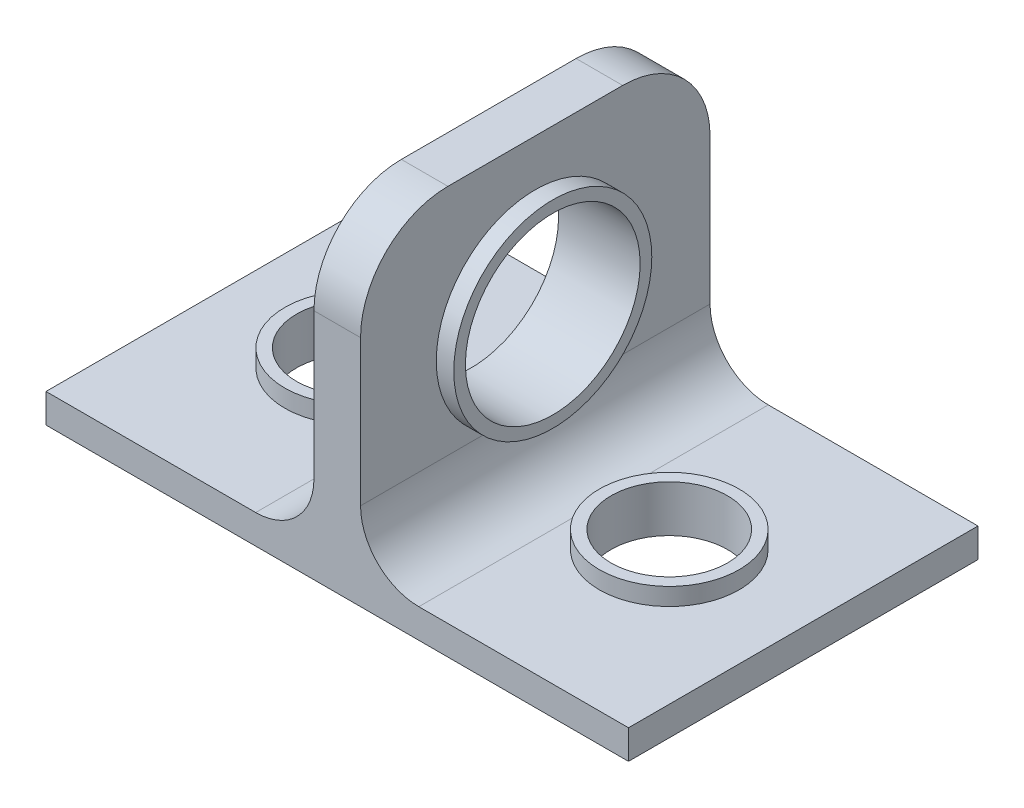
ISO-10303-21;
HEADER;
FILE_DESCRIPTION(('STEP AP214'),'2;1');
FILE_NAME('part.step','',(''),(''),'','','');
FILE_SCHEMA(('AUTOMOTIVE_DESIGN { 1 0 10303 214 1 1 1 1 }'));
ENDSEC;
DATA;
#1=APPLICATION_CONTEXT('core data for automotive mechanical design processes');
#2=APPLICATION_PROTOCOL_DEFINITION('international standard','automotive_design',2000,#1);
#3=PRODUCT_CONTEXT('',#1,'mechanical');
#4=PRODUCT('Part','Part','',(#3));
#5=PRODUCT_RELATED_PRODUCT_CATEGORY('part','',(#4));
#6=PRODUCT_DEFINITION_FORMATION('','',#4);
#7=PRODUCT_DEFINITION_CONTEXT('part definition',#1,'design');
#8=PRODUCT_DEFINITION('design','',#6,#7);
#9=PRODUCT_DEFINITION_SHAPE('','',#8);
#10=(LENGTH_UNIT() NAMED_UNIT(*) SI_UNIT(.MILLI.,.METRE.));
#11=(NAMED_UNIT(*) PLANE_ANGLE_UNIT() SI_UNIT($,.RADIAN.));
#12=(NAMED_UNIT(*) SI_UNIT($,.STERADIAN.) SOLID_ANGLE_UNIT());
#13=UNCERTAINTY_MEASURE_WITH_UNIT(LENGTH_MEASURE(1.E-05),#10,'distance_accuracy_value','');
#14=(GEOMETRIC_REPRESENTATION_CONTEXT(3) GLOBAL_UNCERTAINTY_ASSIGNED_CONTEXT((#13)) GLOBAL_UNIT_ASSIGNED_CONTEXT((#10,
#11,#12)) REPRESENTATION_CONTEXT('',''));
#15=CARTESIAN_POINT('',(0.,0.,0.));
#16=DIRECTION('',(0.,0.,1.));
#17=DIRECTION('',(1.,0.,0.));
#18=AXIS2_PLACEMENT_3D('',#15,#16,#17);
#19=CARTESIAN_POINT('',(-14.,15.,-30.));
#20=DIRECTION('',(0.,0.,1.));
#21=DIRECTION('',(1.,0.,0.));
#22=AXIS2_PLACEMENT_3D('',#19,#20,#21);
#23=CYLINDRICAL_SURFACE('',#22,10.);
#24=DIRECTION('',(0.,0.,1.));
#25=VECTOR('',#24,1.);
#26=CARTESIAN_POINT('',(-4.,15.0000000000001,-30.));
#27=LINE('',#26,#25);
#28=CARTESIAN_POINT('',(-4.,15.0000000000001,8.00000000000013));
#29=VERTEX_POINT('',#28);
#30=CARTESIAN_POINT('',(-4.,15.0000000000001,30.));
#31=VERTEX_POINT('',#30);
#32=EDGE_CURVE('E316',#29,#31,#27,.T.);
#33=ORIENTED_EDGE('',*,*,#32,.F.);
#34=CARTESIAN_POINT('',(-4.,15.0000000000001,8.00000000000012));
#35=CARTESIAN_POINT('',(-4.00000486799966,14.900377751049,7.81320903883377));
#36=CARTESIAN_POINT('',(-4.00148805320615,14.8042585845157,7.62458107130544));
#37=CARTESIAN_POINT('',(-4.00682518181483,14.6191477203191,7.24390634337324));
#38=CARTESIAN_POINT('',(-4.01067897341392,14.530155566686,7.05185980264419));
#39=CARTESIAN_POINT('',(-4.02491374910977,14.2741076972079,6.4711080787597));
#40=CARTESIAN_POINT('',(-4.03796916275996,14.1178933153698,6.07762713291724));
#41=CARTESIAN_POINT('',(-4.06703264763406,13.8353905254942,5.28054100431086));
#42=CARTESIAN_POINT('',(-4.08303862544329,13.709081044275,4.87694317376301));
#43=CARTESIAN_POINT('',(-4.11450558018434,13.4868603724836,4.06138667405105));
#44=CARTESIAN_POINT('',(-4.12996648982569,13.390952923544,3.6494269824111));
#45=CARTESIAN_POINT('',(-4.15919230815506,13.2204114768832,2.76941955567808));
#46=CARTESIAN_POINT('',(-4.17252940263093,13.1497249318905,2.30058661382753));
#47=CARTESIAN_POINT('',(-4.19227886205206,13.0477436032132,1.35849340247754));
#48=CARTESIAN_POINT('',(-4.19869093784764,13.0164504643657,0.885232948942356));
#49=CARTESIAN_POINT('',(-4.20336119752856,12.9935069919335,-0.062428056873824));
#50=CARTESIAN_POINT('',(-4.20161707770245,13.0018678586029,-0.536828893434181));
#51=CARTESIAN_POINT('',(-4.19030121997448,13.0581915376799,-1.4831789818672));
#52=CARTESIAN_POINT('',(-4.18072937671124,13.1061548831381,-1.95512820065497));
#53=CARTESIAN_POINT('',(-4.1551742182235,13.2437329813335,-2.91007954202622));
#54=CARTESIAN_POINT('',(-4.13897261516375,13.3347842228982,-3.39286840372245));
#55=CARTESIAN_POINT('',(-4.10382332059191,13.558306128706,-4.34874212168266));
#56=CARTESIAN_POINT('',(-4.0848755031126,13.6907786932434,-4.82182653167231));
#57=CARTESIAN_POINT('',(-4.05820479207035,13.9199212887304,-5.52191925898009));
#58=CARTESIAN_POINT('',(-4.04959797073984,14.0014799686617,-5.75394212484878));
#59=CARTESIAN_POINT('',(-4.03374227472945,14.17460549874,-6.21428513831506));
#60=CARTESIAN_POINT('',(-4.02649337175973,14.2661721403258,-6.44260536296017));
#61=CARTESIAN_POINT('',(-4.01416727999489,14.4591621057481,-6.89513365008931));
#62=CARTESIAN_POINT('',(-4.00909035503783,14.5605866252214,-7.11934120982864));
#63=CARTESIAN_POINT('',(-4.0020121621829,14.7730970721199,-7.56320095532259));
#64=CARTESIAN_POINT('',(-4.00001115821899,14.8841838277635,-7.78285274856779));
#65=CARTESIAN_POINT('',(-4.,15.0000000000001,-8.00000000000012));
#66=B_SPLINE_CURVE_WITH_KNOTS('',3,(#34,#35,#36,#37,#38,#39,#40,#41,#42,#43,#44,#45,#46,#47,#48,
#49,#50,#51,#52,#53,#54,#55,#56,#57,#58,#59,#60,#61,#62,#63,#64,#65),.UNSPECIFIED.,.F.,.F.,(4,2,
2,2,2,2,2,2,2,2,2,2,2,2,2,4),(0.,0.634996958217504,1.26995325828721,2.53931094059223,
3.80777146042295,5.07638803140857,6.49762705126029,7.91892541173113,9.3406252411186,
10.7623442069417,12.2352152307439,13.7081538356573,14.4462333845569,15.1842975551491,
15.9224513556375,16.6606684909713),.UNSPECIFIED.);
#67=CARTESIAN_POINT('',(-4.,15.0000000000001,-8.00000000000013));
#68=VERTEX_POINT('',#67);
#69=EDGE_CURVE('E224',#29,#68,#66,.T.);
#70=ORIENTED_EDGE('',*,*,#69,.T.);
#71=CARTESIAN_POINT('',(-4.,15.0000000000001,-30.));
#72=VERTEX_POINT('',#71);
#73=EDGE_CURVE('E337',#72,#68,#27,.T.);
#74=ORIENTED_EDGE('',*,*,#73,.F.);
#75=CARTESIAN_POINT('',(-14.,15.,-30.));
#76=DIRECTION('',(0.,0.,-1.));
#77=DIRECTION('',(1.,0.,0.));
#78=AXIS2_PLACEMENT_3D('',#75,#76,#77);
#79=CIRCLE('',#78,10.);
#80=CARTESIAN_POINT('',(-14.0000000000001,4.99999999999999,-30.));
#81=VERTEX_POINT('',#80);
#82=EDGE_CURVE('E311',#72,#81,#79,.T.);
#83=ORIENTED_EDGE('',*,*,#82,.T.);
#84=DIRECTION('',(0.,0.,1.));
#85=VECTOR('',#84,1.);
#86=CARTESIAN_POINT('',(-14.0000000000001,4.99999999999999,-30.));
#87=LINE('',#86,#85);
#88=CARTESIAN_POINT('',(-14.0000000000001,4.99999999999999,30.));
#89=VERTEX_POINT('',#88);
#90=EDGE_CURVE('E336',#81,#89,#87,.T.);
#91=ORIENTED_EDGE('',*,*,#90,.T.);
#92=CARTESIAN_POINT('',(-14.,15.,30.));
#93=DIRECTION('',(0.,0.,-1.));
#94=DIRECTION('',(1.,0.,0.));
#95=AXIS2_PLACEMENT_3D('',#92,#93,#94);
#96=CIRCLE('',#95,10.);
#97=EDGE_CURVE('E344',#31,#89,#96,.T.);
#98=ORIENTED_EDGE('',*,*,#97,.F.);
#99=EDGE_LOOP('',(#33,#70,#74,#83,#91,#98));
#100=FACE_BOUND('',#99,.T.);
#101=ADVANCED_FACE('F63',(#100),#23,.F.);
#102=CARTESIAN_POINT('',(-4.,15.0000000000001,-30.));
#103=DIRECTION('',(-1.,0.,0.));
#104=DIRECTION('',(0.,0.,1.));
#105=AXIS2_PLACEMENT_3D('',#102,#103,#104);
#106=PLANE('',#105);
#107=DIRECTION('',(0.,-1.,0.));
#108=VECTOR('',#107,1.);
#109=CARTESIAN_POINT('',(-4.,15.0000000000001,30.));
#110=LINE('',#109,#108);
#111=CARTESIAN_POINT('',(-4.,40.,30.));
#112=VERTEX_POINT('',#111);
#113=EDGE_CURVE('E342',#112,#31,#110,.T.);
#114=ORIENTED_EDGE('',*,*,#113,.F.);
#115=CARTESIAN_POINT('',(-4.,40.,15.));
#116=DIRECTION('',(-1.,0.,0.));
#117=DIRECTION('',(0.,0.,1.));
#118=AXIS2_PLACEMENT_3D('',#115,#116,#117);
#119=CIRCLE('',#118,15.);
#120=CARTESIAN_POINT('',(-4.,55.,15.));
#121=VERTEX_POINT('',#120);
#122=EDGE_CURVE('E300',#112,#121,#119,.T.);
#123=ORIENTED_EDGE('',*,*,#122,.T.);
#124=DIRECTION('',(0.,0.,1.));
#125=VECTOR('',#124,1.);
#126=CARTESIAN_POINT('',(-4.,55.,-30.));
#127=LINE('',#126,#125);
#128=CARTESIAN_POINT('',(-4.,55.,-15.));
#129=VERTEX_POINT('',#128);
#130=EDGE_CURVE('E306',#129,#121,#127,.T.);
#131=ORIENTED_EDGE('',*,*,#130,.F.);
#132=CARTESIAN_POINT('',(-4.,40.,-15.));
#133=DIRECTION('',(-1.,0.,0.));
#134=DIRECTION('',(0.,0.,1.));
#135=AXIS2_PLACEMENT_3D('',#132,#133,#134);
#136=CIRCLE('',#135,15.);
#137=CARTESIAN_POINT('',(-4.,40.,-30.));
#138=VERTEX_POINT('',#137);
#139=EDGE_CURVE('E190',#129,#138,#136,.T.);
#140=ORIENTED_EDGE('',*,*,#139,.T.);
#141=DIRECTION('',(0.,-1.,0.));
#142=VECTOR('',#141,1.);
#143=CARTESIAN_POINT('',(-4.,15.0000000000001,-30.));
#144=LINE('',#143,#142);
#145=EDGE_CURVE('E304',#138,#72,#144,.T.);
#146=ORIENTED_EDGE('',*,*,#145,.T.);
#147=ORIENTED_EDGE('',*,*,#73,.T.);
#148=CARTESIAN_POINT('',(-4.,30.,0.));
#149=DIRECTION('',(-1.,0.,0.));
#150=DIRECTION('',(0.,0.,1.));
#151=AXIS2_PLACEMENT_3D('',#148,#149,#150);
#152=CIRCLE('',#151,17.);
#153=EDGE_CURVE('E235',#29,#68,#152,.T.);
#154=ORIENTED_EDGE('',*,*,#153,.F.);
#155=ORIENTED_EDGE('',*,*,#32,.T.);
#156=EDGE_LOOP('',(#114,#123,#131,#140,#146,#147,#154,#155));
#157=FACE_BOUND('',#156,.T.);
#158=ADVANCED_FACE('F242',(#157),#106,.T.);
#159=CARTESIAN_POINT('',(-50.,4.99999999999999,-30.));
#160=DIRECTION('',(0.,1.,0.));
#161=DIRECTION('',(0.,0.,1.));
#162=AXIS2_PLACEMENT_3D('',#159,#160,#161);
#163=PLANE('',#162);
#164=DIRECTION('',(0.,0.,1.));
#165=VECTOR('',#164,1.);
#166=CARTESIAN_POINT('',(-50.,4.99999999999999,-30.));
#167=LINE('',#166,#165);
#168=CARTESIAN_POINT('',(-50.,4.99999999999999,-30.));
#169=VERTEX_POINT('',#168);
#170=CARTESIAN_POINT('',(-50.,4.99999999999999,30.));
#171=VERTEX_POINT('',#170);
#172=EDGE_CURVE('E193',#169,#171,#167,.T.);
#173=ORIENTED_EDGE('',*,*,#172,.T.);
#174=DIRECTION('',(-1.,0.,0.));
#175=VECTOR('',#174,1.);
#176=CARTESIAN_POINT('',(-50.,4.99999999999999,30.));
#177=LINE('',#176,#175);
#178=EDGE_CURVE('E348',#89,#171,#177,.T.);
#179=ORIENTED_EDGE('',*,*,#178,.F.);
#180=ORIENTED_EDGE('',*,*,#90,.F.);
#181=DIRECTION('',(-1.,0.,0.));
#182=VECTOR('',#181,1.);
#183=CARTESIAN_POINT('',(-50.,4.99999999999999,-30.));
#184=LINE('',#183,#182);
#185=EDGE_CURVE('E326',#81,#169,#184,.T.);
#186=ORIENTED_EDGE('',*,*,#185,.T.);
#187=EDGE_LOOP('',(#173,#179,#180,#186));
#188=FACE_BOUND('',#187,.T.);
#189=CARTESIAN_POINT('',(-27.,4.99999999999999,0.));
#190=DIRECTION('',(0.,1.,0.));
#191=DIRECTION('',(0.,0.,1.));
#192=AXIS2_PLACEMENT_3D('',#189,#190,#191);
#193=CIRCLE('',#192,12.);
#194=CARTESIAN_POINT('',(-27.,4.99999999999999,12.));
#195=VERTEX_POINT('',#194);
#196=EDGE_CURVE('E395',#195,#195,#193,.T.);
#197=ORIENTED_EDGE('',*,*,#196,.F.);
#198=EDGE_LOOP('',(#197));
#199=FACE_BOUND('',#198,.T.);
#200=ADVANCED_FACE('F244',(#188,#199),#163,.T.);
#201=CARTESIAN_POINT('',(-50.,0.,-30.));
#202=DIRECTION('',(-1.,0.,0.));
#203=DIRECTION('',(0.,0.,1.));
#204=AXIS2_PLACEMENT_3D('',#201,#202,#203);
#205=PLANE('',#204);
#206=DIRECTION('',(0.,0.,1.));
#207=VECTOR('',#206,1.);
#208=CARTESIAN_POINT('',(-50.,0.,-30.));
#209=LINE('',#208,#207);
#210=CARTESIAN_POINT('',(-50.,0.,-30.));
#211=VERTEX_POINT('',#210);
#212=CARTESIAN_POINT('',(-50.,0.,30.));
#213=VERTEX_POINT('',#212);
#214=EDGE_CURVE('E325',#211,#213,#209,.T.);
#215=ORIENTED_EDGE('',*,*,#214,.T.);
#216=DIRECTION('',(0.,-1.,0.));
#217=VECTOR('',#216,1.);
#218=CARTESIAN_POINT('',(-50.,0.,30.));
#219=LINE('',#218,#217);
#220=EDGE_CURVE('E380',#171,#213,#219,.T.);
#221=ORIENTED_EDGE('',*,*,#220,.F.);
#222=ORIENTED_EDGE('',*,*,#172,.F.);
#223=DIRECTION('',(0.,-1.,0.));
#224=VECTOR('',#223,1.);
#225=CARTESIAN_POINT('',(-50.,0.,-30.));
#226=LINE('',#225,#224);
#227=EDGE_CURVE('E350',#169,#211,#226,.T.);
#228=ORIENTED_EDGE('',*,*,#227,.T.);
#229=EDGE_LOOP('',(#215,#221,#222,#228));
#230=FACE_BOUND('',#229,.T.);
#231=ADVANCED_FACE('F251',(#230),#205,.T.);
#232=CARTESIAN_POINT('',(-4.,55.,-30.));
#233=DIRECTION('',(0.,1.,0.));
#234=DIRECTION('',(0.,0.,1.));
#235=AXIS2_PLACEMENT_3D('',#232,#233,#234);
#236=PLANE('',#235);
#237=ORIENTED_EDGE('',*,*,#130,.T.);
#238=DIRECTION('',(-1.,0.,0.));
#239=VECTOR('',#238,1.);
#240=CARTESIAN_POINT('',(-4.,55.,15.));
#241=LINE('',#240,#239);
#242=CARTESIAN_POINT('',(4.,55.,15.));
#243=VERTEX_POINT('',#242);
#244=EDGE_CURVE('E84',#121,#243,#241,.F.);
#245=ORIENTED_EDGE('',*,*,#244,.T.);
#246=DIRECTION('',(0.,0.,1.));
#247=VECTOR('',#246,1.);
#248=CARTESIAN_POINT('',(4.,55.,-30.));
#249=LINE('',#248,#247);
#250=CARTESIAN_POINT('',(4.,55.,-15.));
#251=VERTEX_POINT('',#250);
#252=EDGE_CURVE('E174',#251,#243,#249,.T.);
#253=ORIENTED_EDGE('',*,*,#252,.F.);
#254=DIRECTION('',(-1.,0.,0.));
#255=VECTOR('',#254,1.);
#256=CARTESIAN_POINT('',(-4.,55.,-15.));
#257=LINE('',#256,#255);
#258=EDGE_CURVE('E297',#251,#129,#257,.T.);
#259=ORIENTED_EDGE('',*,*,#258,.T.);
#260=EDGE_LOOP('',(#237,#245,#253,#259));
#261=FACE_BOUND('',#260,.T.);
#262=ADVANCED_FACE('F249',(#261),#236,.T.);
#263=CARTESIAN_POINT('',(4.,15.0000000000001,-30.));
#264=DIRECTION('',(1.,0.,0.));
#265=DIRECTION('',(0.,0.,-1.));
#266=AXIS2_PLACEMENT_3D('',#263,#264,#265);
#267=PLANE('',#266);
#268=ORIENTED_EDGE('',*,*,#252,.T.);
#269=CARTESIAN_POINT('',(4.,40.,15.));
#270=DIRECTION('',(1.,0.,0.));
#271=DIRECTION('',(0.,0.,-1.));
#272=AXIS2_PLACEMENT_3D('',#269,#270,#271);
#273=CIRCLE('',#272,15.);
#274=CARTESIAN_POINT('',(4.,40.,30.));
#275=VERTEX_POINT('',#274);
#276=EDGE_CURVE('E71',#243,#275,#273,.T.);
#277=ORIENTED_EDGE('',*,*,#276,.T.);
#278=DIRECTION('',(0.,1.,0.));
#279=VECTOR('',#278,1.);
#280=CARTESIAN_POINT('',(4.,15.0000000000001,30.));
#281=LINE('',#280,#279);
#282=CARTESIAN_POINT('',(4.,15.0000000000001,30.));
#283=VERTEX_POINT('',#282);
#284=EDGE_CURVE('E352',#283,#275,#281,.T.);
#285=ORIENTED_EDGE('',*,*,#284,.F.);
#286=DIRECTION('',(0.,0.,1.));
#287=VECTOR('',#286,1.);
#288=CARTESIAN_POINT('',(4.,15.0000000000001,-30.));
#289=LINE('',#288,#287);
#290=CARTESIAN_POINT('',(4.,15.0000000000001,7.99999999999999));
#291=VERTEX_POINT('',#290);
#292=EDGE_CURVE('E175',#291,#283,#289,.T.);
#293=ORIENTED_EDGE('',*,*,#292,.F.);
#294=CARTESIAN_POINT('',(4.,30.,0.));
#295=DIRECTION('',(-1.,0.,0.));
#296=DIRECTION('',(0.,0.,1.));
#297=AXIS2_PLACEMENT_3D('',#294,#295,#296);
#298=CIRCLE('',#297,17.);
#299=CARTESIAN_POINT('',(4.,15.,-7.99999999999999));
#300=VERTEX_POINT('',#299);
#301=EDGE_CURVE('E178',#291,#300,#298,.T.);
#302=ORIENTED_EDGE('',*,*,#301,.T.);
#303=CARTESIAN_POINT('',(4.,15.0000000000001,-30.));
#304=VERTEX_POINT('',#303);
#305=EDGE_CURVE('E165',#304,#300,#289,.T.);
#306=ORIENTED_EDGE('',*,*,#305,.F.);
#307=DIRECTION('',(0.,1.,0.));
#308=VECTOR('',#307,1.);
#309=CARTESIAN_POINT('',(4.,15.0000000000001,-30.));
#310=LINE('',#309,#308);
#311=CARTESIAN_POINT('',(4.,40.,-30.));
#312=VERTEX_POINT('',#311);
#313=EDGE_CURVE('E312',#304,#312,#310,.T.);
#314=ORIENTED_EDGE('',*,*,#313,.T.);
#315=CARTESIAN_POINT('',(4.,40.,-15.));
#316=DIRECTION('',(1.,0.,0.));
#317=DIRECTION('',(0.,0.,-1.));
#318=AXIS2_PLACEMENT_3D('',#315,#316,#317);
#319=CIRCLE('',#318,15.);
#320=EDGE_CURVE('E293',#312,#251,#319,.T.);
#321=ORIENTED_EDGE('',*,*,#320,.T.);
#322=EDGE_LOOP('',(#268,#277,#285,#293,#302,#306,#314,#321));
#323=FACE_BOUND('',#322,.T.);
#324=ADVANCED_FACE('F179',(#323),#267,.T.);
#325=CARTESIAN_POINT('',(14.,15.,-30.));
#326=DIRECTION('',(0.,0.,1.));
#327=DIRECTION('',(1.,0.,0.));
#328=AXIS2_PLACEMENT_3D('',#325,#326,#327);
#329=CYLINDRICAL_SURFACE('',#328,10.);
#330=CARTESIAN_POINT('',(4.,15.0000000000001,8.00000000000013));
#331=CARTESIAN_POINT('',(4.00000486799966,14.900377751049,7.81320903883377));
#332=CARTESIAN_POINT('',(4.00148805320616,14.8042585845157,7.62458107130544));
#333=CARTESIAN_POINT('',(4.00682518181483,14.6191477203191,7.24390634337325));
#334=CARTESIAN_POINT('',(4.01067897341392,14.530155566686,7.05185980264419));
#335=CARTESIAN_POINT('',(4.02491374910977,14.2741076972079,6.4711080787597));
#336=CARTESIAN_POINT('',(4.03796916275996,14.1178933153698,6.07762713291725));
#337=CARTESIAN_POINT('',(4.06703264763406,13.8353905254942,5.28054100431087));
#338=CARTESIAN_POINT('',(4.08303862544329,13.709081044275,4.87694317376302));
#339=CARTESIAN_POINT('',(4.11450558018433,13.4868603724836,4.06138667405105));
#340=CARTESIAN_POINT('',(4.12996648982569,13.390952923544,3.6494269824111));
#341=CARTESIAN_POINT('',(4.15919230815506,13.2204114768832,2.76941955567809));
#342=CARTESIAN_POINT('',(4.17252940263093,13.1497249318905,2.30058661382754));
#343=CARTESIAN_POINT('',(4.19227886205205,13.0477436032132,1.35849340247754));
#344=CARTESIAN_POINT('',(4.19869093784764,13.0164504643657,0.88523294894236));
#345=CARTESIAN_POINT('',(4.20336119752856,12.9935069919335,-0.0624280568738192));
#346=CARTESIAN_POINT('',(4.20161707770245,13.0018678586029,-0.536828893434176));
#347=CARTESIAN_POINT('',(4.19030121997448,13.0581915376799,-1.4831789818672));
#348=CARTESIAN_POINT('',(4.18072937671124,13.1061548831381,-1.95512820065497));
#349=CARTESIAN_POINT('',(4.1551742182235,13.2437329813335,-2.91007954202622));
#350=CARTESIAN_POINT('',(4.13897261516375,13.3347842228982,-3.39286840372245));
#351=CARTESIAN_POINT('',(4.10382332059191,13.558306128706,-4.34874212168267));
#352=CARTESIAN_POINT('',(4.0848755031126,13.6907786932434,-4.82182653167231));
#353=CARTESIAN_POINT('',(4.05820479207035,13.9199212887304,-5.52191925898009));
#354=CARTESIAN_POINT('',(4.04959797073984,14.0014799686617,-5.75394212484878));
#355=CARTESIAN_POINT('',(4.03374227472946,14.17460549874,-6.21428513831507));
#356=CARTESIAN_POINT('',(4.02649337175973,14.2661721403258,-6.44260536296018));
#357=CARTESIAN_POINT('',(4.01416727999489,14.4591621057481,-6.89513365008931));
#358=CARTESIAN_POINT('',(4.00909035503783,14.5605866252214,-7.11934120982865));
#359=CARTESIAN_POINT('',(4.0020121621829,14.7730970721199,-7.56320095532259));
#360=CARTESIAN_POINT('',(4.00001115821899,14.8841838277635,-7.7828527485678));
#361=CARTESIAN_POINT('',(4.,15.0000000000001,-8.00000000000012));
#362=B_SPLINE_CURVE_WITH_KNOTS('',3,(#330,#331,#332,#333,#334,#335,#336,#337,#338,#339,#340,
#341,#342,#343,#344,#345,#346,#347,#348,#349,#350,#351,#352,#353,#354,#355,#356,#357,#358,#359,
#360,#361),.UNSPECIFIED.,.F.,.F.,(4,2,2,2,2,2,2,2,2,2,2,2,2,2,2,4),(0.,0.634996958217504,
1.26995325828721,2.53931094059223,3.80777146042295,5.07638803140857,6.49762705126029,
7.91892541173113,9.3406252411186,10.7623442069417,12.2352152307439,13.7081538356573,
14.446233384557,15.1842975551491,15.9224513556376,16.6606684909713),.UNSPECIFIED.);
#363=EDGE_CURVE('E169',#291,#300,#362,.T.);
#364=ORIENTED_EDGE('',*,*,#363,.F.);
#365=ORIENTED_EDGE('',*,*,#292,.T.);
#366=CARTESIAN_POINT('',(14.,15.,30.));
#367=DIRECTION('',(0.,0.,-1.));
#368=DIRECTION('',(1.,0.,0.));
#369=AXIS2_PLACEMENT_3D('',#366,#367,#368);
#370=CIRCLE('',#369,10.);
#371=CARTESIAN_POINT('',(14.0000000000001,4.99999999999999,30.));
#372=VERTEX_POINT('',#371);
#373=EDGE_CURVE('E389',#372,#283,#370,.T.);
#374=ORIENTED_EDGE('',*,*,#373,.F.);
#375=DIRECTION('',(0.,0.,1.));
#376=VECTOR('',#375,1.);
#377=CARTESIAN_POINT('',(14.0000000000001,4.99999999999999,-30.));
#378=LINE('',#377,#376);
#379=CARTESIAN_POINT('',(14.0000000000001,4.99999999999999,-30.));
#380=VERTEX_POINT('',#379);
#381=EDGE_CURVE('E320',#380,#372,#378,.T.);
#382=ORIENTED_EDGE('',*,*,#381,.F.);
#383=CARTESIAN_POINT('',(14.,15.,-30.));
#384=DIRECTION('',(0.,0.,-1.));
#385=DIRECTION('',(1.,0.,0.));
#386=AXIS2_PLACEMENT_3D('',#383,#384,#385);
#387=CIRCLE('',#386,10.);
#388=EDGE_CURVE('E172',#380,#304,#387,.T.);
#389=ORIENTED_EDGE('',*,*,#388,.T.);
#390=ORIENTED_EDGE('',*,*,#305,.T.);
#391=EDGE_LOOP('',(#364,#365,#374,#382,#389,#390));
#392=FACE_BOUND('',#391,.T.);
#393=ADVANCED_FACE('F167',(#392),#329,.F.);
#394=CARTESIAN_POINT('',(50.,4.99999999999999,-30.));
#395=DIRECTION('',(0.,1.,0.));
#396=DIRECTION('',(0.,0.,1.));
#397=AXIS2_PLACEMENT_3D('',#394,#395,#396);
#398=PLANE('',#397);
#399=CARTESIAN_POINT('',(27.,4.99999999999999,0.));
#400=DIRECTION('',(0.,1.,0.));
#401=DIRECTION('',(0.,0.,1.));
#402=AXIS2_PLACEMENT_3D('',#399,#400,#401);
#403=CIRCLE('',#402,12.);
#404=CARTESIAN_POINT('',(27.,4.99999999999999,12.));
#405=VERTEX_POINT('',#404);
#406=EDGE_CURVE('E187',#405,#405,#403,.T.);
#407=ORIENTED_EDGE('',*,*,#406,.F.);
#408=EDGE_LOOP('',(#407));
#409=FACE_BOUND('',#408,.T.);
#410=ORIENTED_EDGE('',*,*,#381,.T.);
#411=DIRECTION('',(-1.,0.,0.));
#412=VECTOR('',#411,1.);
#413=CARTESIAN_POINT('',(50.,4.99999999999999,30.));
#414=LINE('',#413,#412);
#415=CARTESIAN_POINT('',(50.,4.99999999999999,30.));
#416=VERTEX_POINT('',#415);
#417=EDGE_CURVE('E382',#416,#372,#414,.T.);
#418=ORIENTED_EDGE('',*,*,#417,.F.);
#419=DIRECTION('',(0.,0.,1.));
#420=VECTOR('',#419,1.);
#421=CARTESIAN_POINT('',(50.,4.99999999999999,-30.));
#422=LINE('',#421,#420);
#423=CARTESIAN_POINT('',(50.,4.99999999999999,-30.));
#424=VERTEX_POINT('',#423);
#425=EDGE_CURVE('E322',#424,#416,#422,.T.);
#426=ORIENTED_EDGE('',*,*,#425,.F.);
#427=DIRECTION('',(-1.,0.,0.));
#428=VECTOR('',#427,1.);
#429=CARTESIAN_POINT('',(50.,4.99999999999999,-30.));
#430=LINE('',#429,#428);
#431=EDGE_CURVE('E363',#424,#380,#430,.T.);
#432=ORIENTED_EDGE('',*,*,#431,.T.);
#433=EDGE_LOOP('',(#410,#418,#426,#432));
#434=FACE_BOUND('',#433,.T.);
#435=ADVANCED_FACE('F257',(#409,#434),#398,.T.);
#436=CARTESIAN_POINT('',(50.,0.,-30.));
#437=DIRECTION('',(1.,0.,0.));
#438=DIRECTION('',(0.,0.,-1.));
#439=AXIS2_PLACEMENT_3D('',#436,#437,#438);
#440=PLANE('',#439);
#441=ORIENTED_EDGE('',*,*,#425,.T.);
#442=DIRECTION('',(0.,1.,0.));
#443=VECTOR('',#442,1.);
#444=CARTESIAN_POINT('',(50.,0.,30.));
#445=LINE('',#444,#443);
#446=CARTESIAN_POINT('',(50.,0.,30.));
#447=VERTEX_POINT('',#446);
#448=EDGE_CURVE('E374',#447,#416,#445,.T.);
#449=ORIENTED_EDGE('',*,*,#448,.F.);
#450=DIRECTION('',(0.,0.,1.));
#451=VECTOR('',#450,1.);
#452=CARTESIAN_POINT('',(50.,0.,-30.));
#453=LINE('',#452,#451);
#454=CARTESIAN_POINT('',(50.,0.,-30.));
#455=VERTEX_POINT('',#454);
#456=EDGE_CURVE('E324',#455,#447,#453,.T.);
#457=ORIENTED_EDGE('',*,*,#456,.F.);
#458=DIRECTION('',(0.,1.,0.));
#459=VECTOR('',#458,1.);
#460=CARTESIAN_POINT('',(50.,0.,-30.));
#461=LINE('',#460,#459);
#462=EDGE_CURVE('E360',#455,#424,#461,.T.);
#463=ORIENTED_EDGE('',*,*,#462,.T.);
#464=EDGE_LOOP('',(#441,#449,#457,#463));
#465=FACE_BOUND('',#464,.T.);
#466=ADVANCED_FACE('F262',(#465),#440,.T.);
#467=CARTESIAN_POINT('',(50.,0.,-30.));
#468=DIRECTION('',(0.,-1.,0.));
#469=DIRECTION('',(0.,0.,-1.));
#470=AXIS2_PLACEMENT_3D('',#467,#468,#469);
#471=PLANE('',#470);
#472=CARTESIAN_POINT('',(27.,0.,0.));
#473=DIRECTION('',(0.,-1.,0.));
#474=DIRECTION('',(0.,0.,-1.));
#475=AXIS2_PLACEMENT_3D('',#472,#473,#474);
#476=CIRCLE('',#475,10.);
#477=CARTESIAN_POINT('',(27.,0.,10.));
#478=VERTEX_POINT('',#477);
#479=EDGE_CURVE('E403',#478,#478,#476,.T.);
#480=ORIENTED_EDGE('',*,*,#479,.F.);
#481=EDGE_LOOP('',(#480));
#482=FACE_BOUND('',#481,.T.);
#483=CARTESIAN_POINT('',(-27.,0.,0.));
#484=DIRECTION('',(0.,-1.,0.));
#485=DIRECTION('',(0.,0.,-1.));
#486=AXIS2_PLACEMENT_3D('',#483,#484,#485);
#487=CIRCLE('',#486,10.);
#488=CARTESIAN_POINT('',(-27.,0.,10.));
#489=VERTEX_POINT('',#488);
#490=EDGE_CURVE('E384',#489,#489,#487,.F.);
#491=ORIENTED_EDGE('',*,*,#490,.T.);
#492=EDGE_LOOP('',(#491));
#493=FACE_BOUND('',#492,.T.);
#494=ORIENTED_EDGE('',*,*,#456,.T.);
#495=DIRECTION('',(1.,0.,0.));
#496=VECTOR('',#495,1.);
#497=CARTESIAN_POINT('',(50.,0.,30.));
#498=LINE('',#497,#496);
#499=EDGE_CURVE('E377',#213,#447,#498,.T.);
#500=ORIENTED_EDGE('',*,*,#499,.F.);
#501=ORIENTED_EDGE('',*,*,#214,.F.);
#502=DIRECTION('',(1.,0.,0.));
#503=VECTOR('',#502,1.);
#504=CARTESIAN_POINT('',(50.,0.,-30.));
#505=LINE('',#504,#503);
#506=EDGE_CURVE('E357',#211,#455,#505,.T.);
#507=ORIENTED_EDGE('',*,*,#506,.T.);
#508=EDGE_LOOP('',(#494,#500,#501,#507));
#509=FACE_BOUND('',#508,.T.);
#510=ADVANCED_FACE('F269',(#482,#493,#509),#471,.T.);
#511=CARTESIAN_POINT('',(-14.,15.,-30.));
#512=DIRECTION('',(0.,0.,1.));
#513=DIRECTION('',(1.,0.,0.));
#514=AXIS2_PLACEMENT_3D('',#511,#512,#513);
#515=PLANE('',#514);
#516=ORIENTED_EDGE('',*,*,#145,.F.);
#517=DIRECTION('',(-1.,0.,0.));
#518=VECTOR('',#517,1.);
#519=CARTESIAN_POINT('',(4.,40.,-30.));
#520=LINE('',#519,#518);
#521=EDGE_CURVE('E12',#138,#312,#520,.F.);
#522=ORIENTED_EDGE('',*,*,#521,.T.);
#523=ORIENTED_EDGE('',*,*,#313,.F.);
#524=ORIENTED_EDGE('',*,*,#388,.F.);
#525=ORIENTED_EDGE('',*,*,#431,.F.);
#526=ORIENTED_EDGE('',*,*,#462,.F.);
#527=ORIENTED_EDGE('',*,*,#506,.F.);
#528=ORIENTED_EDGE('',*,*,#227,.F.);
#529=ORIENTED_EDGE('',*,*,#185,.F.);
#530=ORIENTED_EDGE('',*,*,#82,.F.);
#531=EDGE_LOOP('',(#516,#522,#523,#524,#525,#526,#527,#528,#529,#530));
#532=FACE_BOUND('',#531,.T.);
#533=ADVANCED_FACE('F276',(#532),#515,.F.);
#534=CARTESIAN_POINT('',(-14.,15.,30.));
#535=DIRECTION('',(0.,0.,1.));
#536=DIRECTION('',(1.,0.,0.));
#537=AXIS2_PLACEMENT_3D('',#534,#535,#536);
#538=PLANE('',#537);
#539=ORIENTED_EDGE('',*,*,#284,.T.);
#540=DIRECTION('',(-1.,0.,0.));
#541=VECTOR('',#540,1.);
#542=CARTESIAN_POINT('',(-14.,40.,30.));
#543=LINE('',#542,#541);
#544=EDGE_CURVE('E186',#275,#112,#543,.T.);
#545=ORIENTED_EDGE('',*,*,#544,.T.);
#546=ORIENTED_EDGE('',*,*,#113,.T.);
#547=ORIENTED_EDGE('',*,*,#97,.T.);
#548=ORIENTED_EDGE('',*,*,#178,.T.);
#549=ORIENTED_EDGE('',*,*,#220,.T.);
#550=ORIENTED_EDGE('',*,*,#499,.T.);
#551=ORIENTED_EDGE('',*,*,#448,.T.);
#552=ORIENTED_EDGE('',*,*,#417,.T.);
#553=ORIENTED_EDGE('',*,*,#373,.T.);
#554=EDGE_LOOP('',(#539,#545,#546,#547,#548,#549,#550,#551,#552,#553));
#555=FACE_BOUND('',#554,.T.);
#556=ADVANCED_FACE('F379',(#555),#538,.T.);
#557=CARTESIAN_POINT('',(-27.,-28.2842712474619,0.));
#558=DIRECTION('',(0.,1.,0.));
#559=DIRECTION('',(0.,0.,1.));
#560=AXIS2_PLACEMENT_3D('',#557,#558,#559);
#561=CYLINDRICAL_SURFACE('',#560,10.);
#562=CARTESIAN_POINT('',(-27.,7.99999999999999,0.));
#563=DIRECTION('',(0.,1.,0.));
#564=DIRECTION('',(0.,0.,1.));
#565=AXIS2_PLACEMENT_3D('',#562,#563,#564);
#566=CIRCLE('',#565,10.);
#567=CARTESIAN_POINT('',(-27.,7.99999999999999,10.));
#568=VERTEX_POINT('',#567);
#569=EDGE_CURVE('E398',#568,#568,#566,.T.);
#570=CARTESIAN_POINT('',(-27.,0.,10.));
#571=CARTESIAN_POINT('',(-27.,0.0833333333333333,10.));
#572=CARTESIAN_POINT('',(-27.,0.166666666666667,10.));
#573=CARTESIAN_POINT('',(-27.,0.333333333333334,10.));
#574=CARTESIAN_POINT('',(-27.,0.416666666666667,10.));
#575=CARTESIAN_POINT('',(-27.,0.583333333333334,10.));
#576=CARTESIAN_POINT('',(-27.,0.666666666666667,10.));
#577=CARTESIAN_POINT('',(-27.,0.833333333333334,10.));
#578=CARTESIAN_POINT('',(-27.,0.916666666666668,10.));
#579=CARTESIAN_POINT('',(-27.,1.08333333333333,10.));
#580=CARTESIAN_POINT('',(-27.,1.16666666666667,10.));
#581=CARTESIAN_POINT('',(-27.,1.33333333333333,10.));
#582=CARTESIAN_POINT('',(-27.,1.41666666666666,10.));
#583=CARTESIAN_POINT('',(-27.,1.58333333333333,10.));
#584=CARTESIAN_POINT('',(-27.,1.66666666666666,10.));
#585=CARTESIAN_POINT('',(-27.,1.83333333333333,10.));
#586=CARTESIAN_POINT('',(-27.,1.91666666666666,10.));
#587=CARTESIAN_POINT('',(-27.,2.08333333333333,10.));
#588=CARTESIAN_POINT('',(-27.,2.16666666666667,10.));
#589=CARTESIAN_POINT('',(-27.,2.33333333333333,10.));
#590=CARTESIAN_POINT('',(-27.,2.41666666666667,10.));
#591=CARTESIAN_POINT('',(-27.,2.58333333333333,10.));
#592=CARTESIAN_POINT('',(-27.,2.66666666666667,10.));
#593=CARTESIAN_POINT('',(-27.,2.83333333333333,10.));
#594=CARTESIAN_POINT('',(-27.,2.91666666666666,10.));
#595=CARTESIAN_POINT('',(-27.,3.08333333333333,10.));
#596=CARTESIAN_POINT('',(-27.,3.16666666666666,10.));
#597=CARTESIAN_POINT('',(-27.,3.33333333333333,10.));
#598=CARTESIAN_POINT('',(-27.,3.41666666666666,10.));
#599=CARTESIAN_POINT('',(-27.,3.58333333333333,10.));
#600=CARTESIAN_POINT('',(-27.,3.66666666666666,10.));
#601=CARTESIAN_POINT('',(-27.,3.83333333333333,10.));
#602=CARTESIAN_POINT('',(-27.,3.91666666666666,10.));
#603=CARTESIAN_POINT('',(-27.,4.08333333333333,10.));
#604=CARTESIAN_POINT('',(-27.,4.16666666666666,10.));
#605=CARTESIAN_POINT('',(-27.,4.33333333333333,10.));
#606=CARTESIAN_POINT('',(-27.,4.41666666666666,10.));
#607=CARTESIAN_POINT('',(-27.,4.58333333333333,10.));
#608=CARTESIAN_POINT('',(-27.,4.66666666666666,10.));
#609=CARTESIAN_POINT('',(-27.,4.83333333333333,10.));
#610=CARTESIAN_POINT('',(-27.,4.91666666666666,10.));
#611=CARTESIAN_POINT('',(-27.,5.08333333333333,10.));
#612=CARTESIAN_POINT('',(-27.,5.16666666666666,10.));
#613=CARTESIAN_POINT('',(-27.,5.33333333333333,10.));
#614=CARTESIAN_POINT('',(-27.,5.41666666666666,10.));
#615=CARTESIAN_POINT('',(-27.,5.58333333333333,10.));
#616=CARTESIAN_POINT('',(-27.,5.66666666666666,10.));
#617=CARTESIAN_POINT('',(-27.,5.83333333333332,10.));
#618=CARTESIAN_POINT('',(-27.,5.91666666666665,10.));
#619=CARTESIAN_POINT('',(-27.,6.08333333333332,10.));
#620=CARTESIAN_POINT('',(-27.,6.16666666666665,10.));
#621=CARTESIAN_POINT('',(-27.,6.33333333333332,10.));
#622=CARTESIAN_POINT('',(-27.,6.41666666666665,10.));
#623=CARTESIAN_POINT('',(-27.,6.58333333333332,10.));
#624=CARTESIAN_POINT('',(-27.,6.66666666666665,10.));
#625=CARTESIAN_POINT('',(-27.,6.83333333333332,10.));
#626=CARTESIAN_POINT('',(-27.,6.91666666666666,10.));
#627=CARTESIAN_POINT('',(-27.,7.08333333333332,10.));
#628=CARTESIAN_POINT('',(-27.,7.16666666666666,10.));
#629=CARTESIAN_POINT('',(-27.,7.33333333333332,10.));
#630=CARTESIAN_POINT('',(-27.,7.41666666666666,10.));
#631=CARTESIAN_POINT('',(-27.,7.58333333333332,10.));
#632=CARTESIAN_POINT('',(-27.,7.66666666666666,10.));
#633=CARTESIAN_POINT('',(-27.,7.83333333333332,10.));
#634=CARTESIAN_POINT('',(-27.,7.91666666666666,10.));
#635=CARTESIAN_POINT('',(-27.,7.99999999999999,10.));
#636=B_SPLINE_CURVE_WITH_KNOTS('',3,(#570,#571,#572,#573,#574,#575,#576,#577,#578,#579,#580,
#581,#582,#583,#584,#585,#586,#587,#588,#589,#590,#591,#592,#593,#594,#595,#596,#597,#598,#599,
#600,#601,#602,#603,#604,#605,#606,#607,#608,#609,#610,#611,#612,#613,#614,#615,#616,#617,#618,
#619,#620,#621,#622,#623,#624,#625,#626,#627,#628,#629,#630,#631,#632,#633,#634,#635),
.UNSPECIFIED.,.F.,.F.,(4,2,2,2,2,2,2,2,2,2,2,2,2,2,2,2,2,2,2,2,2,2,2,2,2,2,2,2,2,2,2,2,4),(0.,
0.25,0.5,0.750000000000001,1.,1.25,1.5,1.75,2.,2.25,2.5,2.75,2.99999999999999,3.24999999999999,
3.49999999999999,3.74999999999999,3.99999999999999,4.24999999999999,4.49999999999999,
4.74999999999999,4.99999999999999,5.24999999999999,5.49999999999999,5.74999999999999,
5.99999999999999,6.24999999999999,6.49999999999999,6.74999999999999,6.99999999999999,
7.24999999999999,7.49999999999999,7.74999999999999,7.99999999999999),.UNSPECIFIED.);
#637=EDGE_CURVE('BSEAM430',#489,#568,#636,.T.);
#638=ORIENTED_EDGE('',*,*,#490,.F.);
#639=ORIENTED_EDGE('',*,*,#569,.T.);
#640=ORIENTED_EDGE('',*,*,#637,.T.);
#641=ORIENTED_EDGE('',*,*,#637,.F.);
#642=EDGE_LOOP('',(#638,#640,#639,#641));
#643=FACE_BOUND('',#642,.T.);
#644=ADVANCED_FACE('F430',(#643),#561,.F.);
#645=CARTESIAN_POINT('',(-27.,7.99999999999999,0.));
#646=DIRECTION('',(0.,1.,0.));
#647=DIRECTION('',(0.,0.,1.));
#648=AXIS2_PLACEMENT_3D('',#645,#646,#647);
#649=PLANE('',#648);
#650=CARTESIAN_POINT('',(-27.,7.99999999999999,0.));
#651=DIRECTION('',(0.,1.,0.));
#652=DIRECTION('',(0.,0.,1.));
#653=AXIS2_PLACEMENT_3D('',#650,#651,#652);
#654=CIRCLE('',#653,12.);
#655=CARTESIAN_POINT('',(-27.,7.99999999999999,12.));
#656=VERTEX_POINT('',#655);
#657=EDGE_CURVE('E394',#656,#656,#654,.T.);
#658=ORIENTED_EDGE('',*,*,#657,.T.);
#659=EDGE_LOOP('',(#658));
#660=FACE_BOUND('',#659,.T.);
#661=ORIENTED_EDGE('',*,*,#569,.F.);
#662=EDGE_LOOP('',(#661));
#663=FACE_BOUND('',#662,.T.);
#664=ADVANCED_FACE('F425',(#660,#663),#649,.T.);
#665=CARTESIAN_POINT('',(-27.,7.99999999999999,0.));
#666=DIRECTION('',(0.,-1.,0.));
#667=DIRECTION('',(0.,0.,-1.));
#668=AXIS2_PLACEMENT_3D('',#665,#666,#667);
#669=CYLINDRICAL_SURFACE('',#668,12.);
#670=ORIENTED_EDGE('',*,*,#657,.F.);
#671=EDGE_LOOP('',(#670));
#672=FACE_BOUND('',#671,.T.);
#673=ORIENTED_EDGE('',*,*,#196,.T.);
#674=EDGE_LOOP('',(#673));
#675=FACE_BOUND('',#674,.T.);
#676=ADVANCED_FACE('F418',(#672,#675),#669,.T.);
#677=CARTESIAN_POINT('',(27.,-28.2842712474619,0.));
#678=DIRECTION('',(0.,1.,0.));
#679=DIRECTION('',(0.,0.,1.));
#680=AXIS2_PLACEMENT_3D('',#677,#678,#679);
#681=CYLINDRICAL_SURFACE('',#680,10.);
#682=CARTESIAN_POINT('',(27.,7.99999999999999,0.));
#683=DIRECTION('',(0.,-1.,0.));
#684=DIRECTION('',(0.,0.,1.));
#685=AXIS2_PLACEMENT_3D('',#682,#683,#684);
#686=CIRCLE('',#685,10.);
#687=CARTESIAN_POINT('',(27.,7.99999999999999,10.));
#688=VERTEX_POINT('',#687);
#689=EDGE_CURVE('E233',#688,#688,#686,.T.);
#690=CARTESIAN_POINT('',(27.,0.,10.));
#691=CARTESIAN_POINT('',(27.,0.0833333333333333,10.));
#692=CARTESIAN_POINT('',(27.,0.166666666666667,10.));
#693=CARTESIAN_POINT('',(27.,0.333333333333334,10.));
#694=CARTESIAN_POINT('',(27.,0.416666666666667,10.));
#695=CARTESIAN_POINT('',(27.,0.583333333333334,10.));
#696=CARTESIAN_POINT('',(27.,0.666666666666667,10.));
#697=CARTESIAN_POINT('',(27.,0.833333333333334,10.));
#698=CARTESIAN_POINT('',(27.,0.916666666666668,10.));
#699=CARTESIAN_POINT('',(27.,1.08333333333333,10.));
#700=CARTESIAN_POINT('',(27.,1.16666666666667,10.));
#701=CARTESIAN_POINT('',(27.,1.33333333333333,10.));
#702=CARTESIAN_POINT('',(27.,1.41666666666666,10.));
#703=CARTESIAN_POINT('',(27.,1.58333333333333,10.));
#704=CARTESIAN_POINT('',(27.,1.66666666666666,10.));
#705=CARTESIAN_POINT('',(27.,1.83333333333333,10.));
#706=CARTESIAN_POINT('',(27.,1.91666666666666,10.));
#707=CARTESIAN_POINT('',(27.,2.08333333333333,10.));
#708=CARTESIAN_POINT('',(27.,2.16666666666667,10.));
#709=CARTESIAN_POINT('',(27.,2.33333333333333,10.));
#710=CARTESIAN_POINT('',(27.,2.41666666666667,10.));
#711=CARTESIAN_POINT('',(27.,2.58333333333333,10.));
#712=CARTESIAN_POINT('',(27.,2.66666666666667,10.));
#713=CARTESIAN_POINT('',(27.,2.83333333333333,10.));
#714=CARTESIAN_POINT('',(27.,2.91666666666666,10.));
#715=CARTESIAN_POINT('',(27.,3.08333333333333,10.));
#716=CARTESIAN_POINT('',(27.,3.16666666666666,10.));
#717=CARTESIAN_POINT('',(27.,3.33333333333333,10.));
#718=CARTESIAN_POINT('',(27.,3.41666666666666,10.));
#719=CARTESIAN_POINT('',(27.,3.58333333333333,10.));
#720=CARTESIAN_POINT('',(27.,3.66666666666666,10.));
#721=CARTESIAN_POINT('',(27.,3.83333333333333,10.));
#722=CARTESIAN_POINT('',(27.,3.91666666666666,10.));
#723=CARTESIAN_POINT('',(27.,4.08333333333333,10.));
#724=CARTESIAN_POINT('',(27.,4.16666666666666,10.));
#725=CARTESIAN_POINT('',(27.,4.33333333333333,10.));
#726=CARTESIAN_POINT('',(27.,4.41666666666666,10.));
#727=CARTESIAN_POINT('',(27.,4.58333333333333,10.));
#728=CARTESIAN_POINT('',(27.,4.66666666666666,10.));
#729=CARTESIAN_POINT('',(27.,4.83333333333333,10.));
#730=CARTESIAN_POINT('',(27.,4.91666666666666,10.));
#731=CARTESIAN_POINT('',(27.,5.08333333333333,10.));
#732=CARTESIAN_POINT('',(27.,5.16666666666666,10.));
#733=CARTESIAN_POINT('',(27.,5.33333333333333,10.));
#734=CARTESIAN_POINT('',(27.,5.41666666666666,10.));
#735=CARTESIAN_POINT('',(27.,5.58333333333333,10.));
#736=CARTESIAN_POINT('',(27.,5.66666666666666,10.));
#737=CARTESIAN_POINT('',(27.,5.83333333333332,10.));
#738=CARTESIAN_POINT('',(27.,5.91666666666665,10.));
#739=CARTESIAN_POINT('',(27.,6.08333333333332,10.));
#740=CARTESIAN_POINT('',(27.,6.16666666666665,10.));
#741=CARTESIAN_POINT('',(27.,6.33333333333332,10.));
#742=CARTESIAN_POINT('',(27.,6.41666666666665,10.));
#743=CARTESIAN_POINT('',(27.,6.58333333333332,10.));
#744=CARTESIAN_POINT('',(27.,6.66666666666665,10.));
#745=CARTESIAN_POINT('',(27.,6.83333333333332,10.));
#746=CARTESIAN_POINT('',(27.,6.91666666666666,10.));
#747=CARTESIAN_POINT('',(27.,7.08333333333332,10.));
#748=CARTESIAN_POINT('',(27.,7.16666666666666,10.));
#749=CARTESIAN_POINT('',(27.,7.33333333333332,10.));
#750=CARTESIAN_POINT('',(27.,7.41666666666666,10.));
#751=CARTESIAN_POINT('',(27.,7.58333333333332,10.));
#752=CARTESIAN_POINT('',(27.,7.66666666666666,10.));
#753=CARTESIAN_POINT('',(27.,7.83333333333332,10.));
#754=CARTESIAN_POINT('',(27.,7.91666666666666,10.));
#755=CARTESIAN_POINT('',(27.,7.99999999999999,10.));
#756=B_SPLINE_CURVE_WITH_KNOTS('',3,(#690,#691,#692,#693,#694,#695,#696,#697,#698,#699,#700,
#701,#702,#703,#704,#705,#706,#707,#708,#709,#710,#711,#712,#713,#714,#715,#716,#717,#718,#719,
#720,#721,#722,#723,#724,#725,#726,#727,#728,#729,#730,#731,#732,#733,#734,#735,#736,#737,#738,
#739,#740,#741,#742,#743,#744,#745,#746,#747,#748,#749,#750,#751,#752,#753,#754,#755),
.UNSPECIFIED.,.F.,.F.,(4,2,2,2,2,2,2,2,2,2,2,2,2,2,2,2,2,2,2,2,2,2,2,2,2,2,2,2,2,2,2,2,4),(0.,
0.25,0.5,0.750000000000001,1.,1.25,1.5,1.75,2.,2.25,2.5,2.75,2.99999999999999,3.24999999999999,
3.49999999999999,3.74999999999999,3.99999999999999,4.24999999999999,4.49999999999999,
4.74999999999999,4.99999999999999,5.24999999999999,5.49999999999999,5.74999999999999,
5.99999999999999,6.24999999999999,6.49999999999999,6.74999999999999,6.99999999999999,
7.24999999999999,7.49999999999999,7.74999999999999,7.99999999999999),.UNSPECIFIED.);
#757=EDGE_CURVE('BSEAM415',#478,#688,#756,.T.);
#758=ORIENTED_EDGE('',*,*,#479,.T.);
#759=ORIENTED_EDGE('',*,*,#689,.F.);
#760=ORIENTED_EDGE('',*,*,#757,.T.);
#761=ORIENTED_EDGE('',*,*,#757,.F.);
#762=EDGE_LOOP('',(#758,#760,#759,#761));
#763=FACE_BOUND('',#762,.T.);
#764=ADVANCED_FACE('F415',(#763),#681,.F.);
#765=CARTESIAN_POINT('',(27.,7.99999999999999,0.));
#766=DIRECTION('',(0.,-1.,0.));
#767=DIRECTION('',(0.,0.,-1.));
#768=AXIS2_PLACEMENT_3D('',#765,#766,#767);
#769=CYLINDRICAL_SURFACE('',#768,12.);
#770=CARTESIAN_POINT('',(27.,7.99999999999999,0.));
#771=DIRECTION('',(0.,-1.,0.));
#772=DIRECTION('',(0.,0.,1.));
#773=AXIS2_PLACEMENT_3D('',#770,#771,#772);
#774=CIRCLE('',#773,12.);
#775=CARTESIAN_POINT('',(27.,7.99999999999999,12.));
#776=VERTEX_POINT('',#775);
#777=EDGE_CURVE('E405',#776,#776,#774,.T.);
#778=ORIENTED_EDGE('',*,*,#777,.T.);
#779=EDGE_LOOP('',(#778));
#780=FACE_BOUND('',#779,.T.);
#781=ORIENTED_EDGE('',*,*,#406,.T.);
#782=EDGE_LOOP('',(#781));
#783=FACE_BOUND('',#782,.T.);
#784=ADVANCED_FACE('F417',(#780,#783),#769,.T.);
#785=CARTESIAN_POINT('',(27.,7.99999999999999,0.));
#786=DIRECTION('',(0.,1.,0.));
#787=DIRECTION('',(0.,0.,1.));
#788=AXIS2_PLACEMENT_3D('',#785,#786,#787);
#789=PLANE('',#788);
#790=ORIENTED_EDGE('',*,*,#689,.T.);
#791=EDGE_LOOP('',(#790));
#792=FACE_BOUND('',#791,.T.);
#793=ORIENTED_EDGE('',*,*,#777,.F.);
#794=EDGE_LOOP('',(#793));
#795=FACE_BOUND('',#794,.T.);
#796=ADVANCED_FACE('F412',(#792,#795),#789,.T.);
#797=CARTESIAN_POINT('',(46.4264068711929,30.,0.));
#798=DIRECTION('',(-1.,0.,0.));
#799=DIRECTION('',(0.,0.,1.));
#800=AXIS2_PLACEMENT_3D('',#797,#798,#799);
#801=CYLINDRICAL_SURFACE('',#800,15.);
#802=CARTESIAN_POINT('',(-7.,30.,0.));
#803=DIRECTION('',(-1.,0.,0.));
#804=DIRECTION('',(0.,0.,1.));
#805=AXIS2_PLACEMENT_3D('',#802,#803,#804);
#806=CIRCLE('',#805,15.);
#807=CARTESIAN_POINT('',(-7.,30.,15.));
#808=VERTEX_POINT('',#807);
#809=EDGE_CURVE('E589',#808,#808,#806,.T.);
#810=ORIENTED_EDGE('',*,*,#809,.T.);
#811=EDGE_LOOP('',(#810));
#812=FACE_BOUND('',#811,.T.);
#813=CARTESIAN_POINT('',(7.,30.,0.));
#814=DIRECTION('',(-1.,0.,0.));
#815=DIRECTION('',(0.,0.,1.));
#816=AXIS2_PLACEMENT_3D('',#813,#814,#815);
#817=CIRCLE('',#816,15.);
#818=CARTESIAN_POINT('',(7.,30.,15.));
#819=VERTEX_POINT('',#818);
#820=EDGE_CURVE('E183',#819,#819,#817,.T.);
#821=ORIENTED_EDGE('',*,*,#820,.F.);
#822=EDGE_LOOP('',(#821));
#823=FACE_BOUND('',#822,.T.);
#824=ADVANCED_FACE('F216',(#812,#823),#801,.F.);
#825=CARTESIAN_POINT('',(-7.,30.,0.));
#826=DIRECTION('',(-1.,0.,0.));
#827=DIRECTION('',(0.,0.,1.));
#828=AXIS2_PLACEMENT_3D('',#825,#826,#827);
#829=PLANE('',#828);
#830=CARTESIAN_POINT('',(-7.,30.,0.));
#831=DIRECTION('',(-1.,0.,0.));
#832=DIRECTION('',(0.,0.,1.));
#833=AXIS2_PLACEMENT_3D('',#830,#831,#832);
#834=CIRCLE('',#833,17.);
#835=CARTESIAN_POINT('',(-7.,30.,17.));
#836=VERTEX_POINT('',#835);
#837=EDGE_CURVE('E234',#836,#836,#834,.T.);
#838=ORIENTED_EDGE('',*,*,#837,.T.);
#839=EDGE_LOOP('',(#838));
#840=FACE_BOUND('',#839,.T.);
#841=ORIENTED_EDGE('',*,*,#809,.F.);
#842=EDGE_LOOP('',(#841));
#843=FACE_BOUND('',#842,.T.);
#844=ADVANCED_FACE('F213',(#840,#843),#829,.T.);
#845=CARTESIAN_POINT('',(-7.,30.,0.));
#846=DIRECTION('',(1.,0.,0.));
#847=DIRECTION('',(0.,0.,-1.));
#848=AXIS2_PLACEMENT_3D('',#845,#846,#847);
#849=CYLINDRICAL_SURFACE('',#848,17.);
#850=ORIENTED_EDGE('',*,*,#69,.F.);
#851=ORIENTED_EDGE('',*,*,#153,.T.);
#852=EDGE_LOOP('',(#850,#851));
#853=FACE_BOUND('',#852,.T.);
#854=ORIENTED_EDGE('',*,*,#837,.F.);
#855=EDGE_LOOP('',(#854));
#856=FACE_BOUND('',#855,.T.);
#857=ADVANCED_FACE('F211',(#853,#856),#849,.T.);
#858=CARTESIAN_POINT('',(7.,30.,0.));
#859=DIRECTION('',(-1.,0.,0.));
#860=DIRECTION('',(0.,0.,1.));
#861=AXIS2_PLACEMENT_3D('',#858,#859,#860);
#862=CYLINDRICAL_SURFACE('',#861,17.);
#863=CARTESIAN_POINT('',(7.,30.,0.));
#864=DIRECTION('',(-1.,0.,0.));
#865=DIRECTION('',(0.,0.,1.));
#866=AXIS2_PLACEMENT_3D('',#863,#864,#865);
#867=CIRCLE('',#866,17.);
#868=CARTESIAN_POINT('',(7.,30.,17.));
#869=VERTEX_POINT('',#868);
#870=EDGE_CURVE('E182',#869,#869,#867,.T.);
#871=ORIENTED_EDGE('',*,*,#870,.T.);
#872=EDGE_LOOP('',(#871));
#873=FACE_BOUND('',#872,.T.);
#874=ORIENTED_EDGE('',*,*,#301,.F.);
#875=ORIENTED_EDGE('',*,*,#363,.T.);
#876=EDGE_LOOP('',(#874,#875));
#877=FACE_BOUND('',#876,.T.);
#878=ADVANCED_FACE('F185',(#873,#877),#862,.T.);
#879=CARTESIAN_POINT('',(7.,30.,0.));
#880=DIRECTION('',(1.,0.,0.));
#881=DIRECTION('',(0.,0.,1.));
#882=AXIS2_PLACEMENT_3D('',#879,#880,#881);
#883=PLANE('',#882);
#884=ORIENTED_EDGE('',*,*,#820,.T.);
#885=EDGE_LOOP('',(#884));
#886=FACE_BOUND('',#885,.T.);
#887=ORIENTED_EDGE('',*,*,#870,.F.);
#888=EDGE_LOOP('',(#887));
#889=FACE_BOUND('',#888,.T.);
#890=ADVANCED_FACE('F210',(#886,#889),#883,.T.);
#891=CARTESIAN_POINT('',(-14.,40.,15.));
#892=DIRECTION('',(-1.,0.,0.));
#893=DIRECTION('',(0.,0.,1.));
#894=AXIS2_PLACEMENT_3D('',#891,#892,#893);
#895=CYLINDRICAL_SURFACE('',#894,15.);
#896=ORIENTED_EDGE('',*,*,#276,.F.);
#897=ORIENTED_EDGE('',*,*,#244,.F.);
#898=ORIENTED_EDGE('',*,*,#122,.F.);
#899=ORIENTED_EDGE('',*,*,#544,.F.);
#900=EDGE_LOOP('',(#896,#897,#898,#899));
#901=FACE_BOUND('',#900,.T.);
#902=ADVANCED_FACE('F280',(#901),#895,.T.);
#903=CARTESIAN_POINT('',(-4.,40.,-15.));
#904=DIRECTION('',(1.,0.,0.));
#905=DIRECTION('',(0.,0.,-1.));
#906=AXIS2_PLACEMENT_3D('',#903,#904,#905);
#907=CYLINDRICAL_SURFACE('',#906,15.);
#908=ORIENTED_EDGE('',*,*,#320,.F.);
#909=ORIENTED_EDGE('',*,*,#521,.F.);
#910=ORIENTED_EDGE('',*,*,#139,.F.);
#911=ORIENTED_EDGE('',*,*,#258,.F.);
#912=EDGE_LOOP('',(#908,#909,#910,#911));
#913=FACE_BOUND('',#912,.T.);
#914=ADVANCED_FACE('F65',(#913),#907,.T.);
#915=CLOSED_SHELL('',(#101,#158,#200,#231,#262,#324,#393,#435,#466,#510,#533,#556,#644,#664,
#676,#764,#784,#796,#824,#844,#857,#878,#890,#902,#914));
#916=MANIFOLD_SOLID_BREP('B2',#915);
#917=ADVANCED_BREP_SHAPE_REPRESENTATION('',(#18,#916),#14);
#918=SHAPE_DEFINITION_REPRESENTATION(#9,#917);
ENDSEC;
END-ISO-10303-21;
